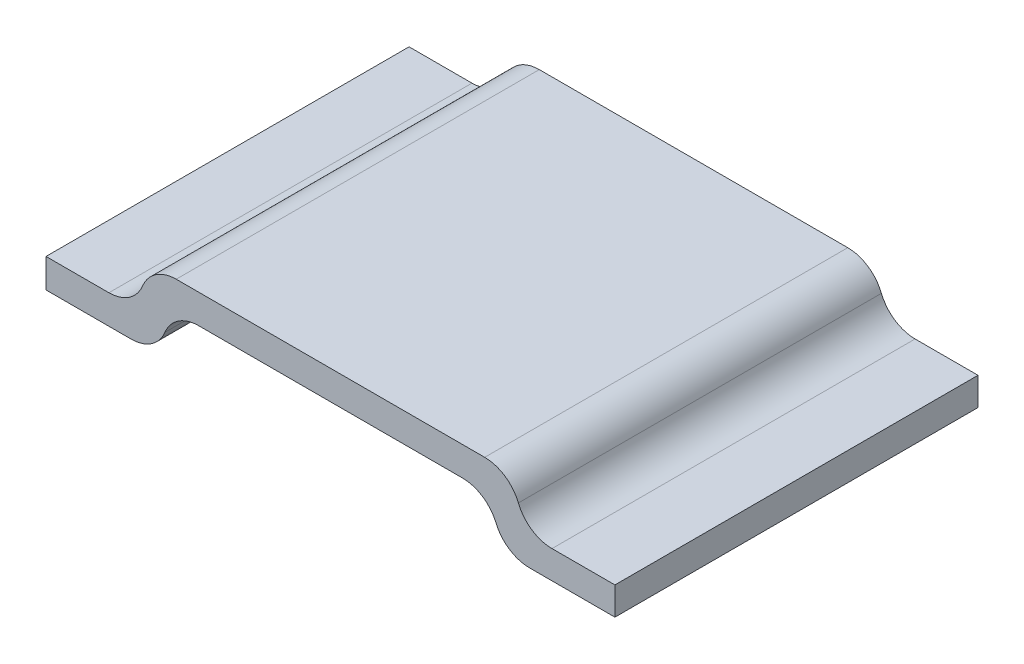
ISO-10303-21;
HEADER;
FILE_DESCRIPTION(('STEP AP214'),'2;1');
FILE_NAME('part.step','',(''),(''),'','','');
FILE_SCHEMA(('AUTOMOTIVE_DESIGN { 1 0 10303 214 1 1 1 1 }'));
ENDSEC;
DATA;
#1=APPLICATION_CONTEXT('core data for automotive mechanical design processes');
#2=APPLICATION_PROTOCOL_DEFINITION('international standard','automotive_design',2000,#1);
#3=PRODUCT_CONTEXT('',#1,'mechanical');
#4=PRODUCT('Part','Part','',(#3));
#5=PRODUCT_RELATED_PRODUCT_CATEGORY('part','',(#4));
#6=PRODUCT_DEFINITION_FORMATION('','',#4);
#7=PRODUCT_DEFINITION_CONTEXT('part definition',#1,'design');
#8=PRODUCT_DEFINITION('design','',#6,#7);
#9=PRODUCT_DEFINITION_SHAPE('','',#8);
#10=(LENGTH_UNIT() NAMED_UNIT(*) SI_UNIT(.MILLI.,.METRE.));
#11=(NAMED_UNIT(*) PLANE_ANGLE_UNIT() SI_UNIT($,.RADIAN.));
#12=(NAMED_UNIT(*) SI_UNIT($,.STERADIAN.) SOLID_ANGLE_UNIT());
#13=UNCERTAINTY_MEASURE_WITH_UNIT(LENGTH_MEASURE(1.E-05),#10,'distance_accuracy_value','');
#14=(GEOMETRIC_REPRESENTATION_CONTEXT(3) GLOBAL_UNCERTAINTY_ASSIGNED_CONTEXT((#13)) GLOBAL_UNIT_ASSIGNED_CONTEXT((#10,
#11,#12)) REPRESENTATION_CONTEXT('',''));
#15=CARTESIAN_POINT('',(0.,0.,0.));
#16=DIRECTION('',(0.,0.,1.));
#17=DIRECTION('',(1.,0.,0.));
#18=AXIS2_PLACEMENT_3D('',#15,#16,#17);
#19=CARTESIAN_POINT('',(-11.1407915604267,-2.032,25.4));
#20=DIRECTION('',(0.,1.,0.));
#21=DIRECTION('',(0.,0.,1.));
#22=AXIS2_PLACEMENT_3D('',#19,#20,#21);
#23=PLANE('',#22);
#24=DIRECTION('',(1.,0.,0.));
#25=VECTOR('',#24,1.);
#26=CARTESIAN_POINT('',(-11.1407915604267,-2.032,0.));
#27=LINE('',#26,#25);
#28=CARTESIAN_POINT('',(-9.23125475655637,-2.032,0.));
#29=VERTEX_POINT('',#28);
#30=CARTESIAN_POINT('',(9.24226086338546,-2.032,0.));
#31=VERTEX_POINT('',#30);
#32=EDGE_CURVE('E188',#29,#31,#27,.T.);
#33=ORIENTED_EDGE('',*,*,#32,.T.);
#34=DIRECTION('',(0.,0.,-1.));
#35=VECTOR('',#34,1.);
#36=CARTESIAN_POINT('',(9.24226086338547,-2.032,25.4));
#37=LINE('',#36,#35);
#38=CARTESIAN_POINT('',(9.24226086338546,-2.032,25.4));
#39=VERTEX_POINT('',#38);
#40=EDGE_CURVE('E249',#31,#39,#37,.F.);
#41=ORIENTED_EDGE('',*,*,#40,.T.);
#42=DIRECTION('',(1.,0.,0.));
#43=VECTOR('',#42,1.);
#44=CARTESIAN_POINT('',(-11.1407915604267,-2.032,25.4));
#45=LINE('',#44,#43);
#46=CARTESIAN_POINT('',(-9.23125475655637,-2.032,25.4));
#47=VERTEX_POINT('',#46);
#48=EDGE_CURVE('E158',#47,#39,#45,.T.);
#49=ORIENTED_EDGE('',*,*,#48,.F.);
#50=DIRECTION('',(0.,0.,-1.));
#51=VECTOR('',#50,1.);
#52=CARTESIAN_POINT('',(-9.23125475655637,-2.032,25.4));
#53=LINE('',#52,#51);
#54=EDGE_CURVE('E246',#47,#29,#53,.T.);
#55=ORIENTED_EDGE('',*,*,#54,.T.);
#56=EDGE_LOOP('',(#33,#41,#49,#55));
#57=FACE_BOUND('',#56,.T.);
#58=ADVANCED_FACE('F34',(#57),#23,.F.);
#59=CARTESIAN_POINT('',(11.9713240192223,-5.13158933356001,25.4));
#60=DIRECTION('',(0.,1.,0.));
#61=DIRECTION('',(0.,0.,1.));
#62=AXIS2_PLACEMENT_3D('',#59,#60,#61);
#63=PLANE('',#62);
#64=DIRECTION('',(1.,0.,0.));
#65=VECTOR('',#64,1.);
#66=CARTESIAN_POINT('',(11.9713240192223,-5.13158933356001,25.4));
#67=LINE('',#66,#65);
#68=CARTESIAN_POINT('',(13.9203345686888,-5.13158933356001,25.4));
#69=VERTEX_POINT('',#68);
#70=CARTESIAN_POINT('',(19.9007386859688,-5.13158933356001,25.4));
#71=VERTEX_POINT('',#70);
#72=EDGE_CURVE('E146',#69,#71,#67,.T.);
#73=ORIENTED_EDGE('',*,*,#72,.F.);
#74=DIRECTION('',(0.,0.,-1.));
#75=VECTOR('',#74,1.);
#76=CARTESIAN_POINT('',(13.9203345686888,-5.13158933356001,25.4));
#77=LINE('',#76,#75);
#78=CARTESIAN_POINT('',(13.9203345686888,-5.13158933356001,0.));
#79=VERTEX_POINT('',#78);
#80=EDGE_CURVE('E238',#69,#79,#77,.T.);
#81=ORIENTED_EDGE('',*,*,#80,.T.);
#82=DIRECTION('',(1.,0.,0.));
#83=VECTOR('',#82,1.);
#84=CARTESIAN_POINT('',(11.9713240192223,-5.13158933356001,0.));
#85=LINE('',#84,#83);
#86=CARTESIAN_POINT('',(19.9007386859688,-5.13158933356001,0.));
#87=VERTEX_POINT('',#86);
#88=EDGE_CURVE('E164',#79,#87,#85,.T.);
#89=ORIENTED_EDGE('',*,*,#88,.T.);
#90=DIRECTION('',(0.,0.,-1.));
#91=VECTOR('',#90,1.);
#92=CARTESIAN_POINT('',(19.9007386859688,-5.13158933356001,25.4));
#93=LINE('',#92,#91);
#94=EDGE_CURVE('E161',#71,#87,#93,.T.);
#95=ORIENTED_EDGE('',*,*,#94,.F.);
#96=EDGE_LOOP('',(#73,#81,#89,#95));
#97=FACE_BOUND('',#96,.T.);
#98=ADVANCED_FACE('F162',(#97),#63,.F.);
#99=CARTESIAN_POINT('',(19.9007386859688,-5.13158933356001,25.4));
#100=DIRECTION('',(-1.,0.,0.));
#101=DIRECTION('',(0.,0.,1.));
#102=AXIS2_PLACEMENT_3D('',#99,#100,#101);
#103=PLANE('',#102);
#104=DIRECTION('',(0.,1.,0.));
#105=VECTOR('',#104,1.);
#106=CARTESIAN_POINT('',(19.9007386859688,-5.13158933356001,0.));
#107=LINE('',#106,#105);
#108=CARTESIAN_POINT('',(19.9007386859688,-3.175,0.));
#109=VERTEX_POINT('',#108);
#110=EDGE_CURVE('E192',#87,#109,#107,.T.);
#111=ORIENTED_EDGE('',*,*,#110,.T.);
#112=DIRECTION('',(0.,0.,-1.));
#113=VECTOR('',#112,1.);
#114=CARTESIAN_POINT('',(19.9007386859688,-3.175,25.4));
#115=LINE('',#114,#113);
#116=CARTESIAN_POINT('',(19.9007386859688,-3.175,25.4));
#117=VERTEX_POINT('',#116);
#118=EDGE_CURVE('E168',#117,#109,#115,.T.);
#119=ORIENTED_EDGE('',*,*,#118,.F.);
#120=DIRECTION('',(0.,1.,0.));
#121=VECTOR('',#120,1.);
#122=CARTESIAN_POINT('',(19.9007386859688,-5.13158933356001,25.4));
#123=LINE('',#122,#121);
#124=EDGE_CURVE('E151',#71,#117,#123,.T.);
#125=ORIENTED_EDGE('',*,*,#124,.F.);
#126=ORIENTED_EDGE('',*,*,#94,.T.);
#127=EDGE_LOOP('',(#111,#119,#125,#126));
#128=FACE_BOUND('',#127,.T.);
#129=ADVANCED_FACE('F170',(#128),#103,.F.);
#130=CARTESIAN_POINT('',(13.5507386859688,-3.175,25.4));
#131=DIRECTION('',(0.,-1.,0.));
#132=DIRECTION('',(1.,0.,0.));
#133=AXIS2_PLACEMENT_3D('',#130,#131,#132);
#134=PLANE('',#133);
#135=DIRECTION('',(-1.,0.,0.));
#136=VECTOR('',#135,1.);
#137=CARTESIAN_POINT('',(13.5507386859688,-3.175,0.));
#138=LINE('',#137,#136);
#139=CARTESIAN_POINT('',(15.4997492354354,-3.175,0.));
#140=VERTEX_POINT('',#139);
#141=EDGE_CURVE('E194',#109,#140,#138,.T.);
#142=ORIENTED_EDGE('',*,*,#141,.T.);
#143=DIRECTION('',(0.,0.,-1.));
#144=VECTOR('',#143,1.);
#145=CARTESIAN_POINT('',(15.4997492354354,-3.175,25.4));
#146=LINE('',#145,#144);
#147=CARTESIAN_POINT('',(15.4997492354354,-3.175,25.4));
#148=VERTEX_POINT('',#147);
#149=EDGE_CURVE('E167',#140,#148,#146,.F.);
#150=ORIENTED_EDGE('',*,*,#149,.T.);
#151=DIRECTION('',(-1.,0.,0.));
#152=VECTOR('',#151,1.);
#153=CARTESIAN_POINT('',(13.5507386859688,-3.175,25.4));
#154=LINE('',#153,#152);
#155=EDGE_CURVE('E173',#117,#148,#154,.T.);
#156=ORIENTED_EDGE('',*,*,#155,.F.);
#157=ORIENTED_EDGE('',*,*,#118,.T.);
#158=EDGE_LOOP('',(#142,#150,#156,#157));
#159=FACE_BOUND('',#158,.T.);
#160=ADVANCED_FACE('F334',(#159),#134,.F.);
#161=CARTESIAN_POINT('',(-12.7,0.,25.4));
#162=DIRECTION('',(0.,-1.,0.));
#163=DIRECTION('',(0.,0.,-1.));
#164=AXIS2_PLACEMENT_3D('',#161,#162,#163);
#165=PLANE('',#164);
#166=DIRECTION('',(-1.,0.,0.));
#167=VECTOR('',#166,1.);
#168=CARTESIAN_POINT('',(-12.7,0.,0.));
#169=LINE('',#168,#167);
#170=CARTESIAN_POINT('',(10.7904631961296,0.,0.));
#171=VERTEX_POINT('',#170);
#172=CARTESIAN_POINT('',(-10.7904631961296,0.,0.));
#173=VERTEX_POINT('',#172);
#174=EDGE_CURVE('E197',#171,#173,#169,.T.);
#175=ORIENTED_EDGE('',*,*,#174,.T.);
#176=DIRECTION('',(0.,0.,1.));
#177=VECTOR('',#176,1.);
#178=CARTESIAN_POINT('',(-10.7904631961296,0.,25.4));
#179=LINE('',#178,#177);
#180=CARTESIAN_POINT('',(-10.7904631961296,0.,25.4));
#181=VERTEX_POINT('',#180);
#182=EDGE_CURVE('E42',#173,#181,#179,.T.);
#183=ORIENTED_EDGE('',*,*,#182,.T.);
#184=DIRECTION('',(-1.,0.,0.));
#185=VECTOR('',#184,1.);
#186=CARTESIAN_POINT('',(-12.7,0.,25.4));
#187=LINE('',#186,#185);
#188=CARTESIAN_POINT('',(10.7904631961296,0.,25.4));
#189=VERTEX_POINT('',#188);
#190=EDGE_CURVE('E175',#189,#181,#187,.T.);
#191=ORIENTED_EDGE('',*,*,#190,.F.);
#192=DIRECTION('',(0.,0.,1.));
#193=VECTOR('',#192,1.);
#194=CARTESIAN_POINT('',(10.7904631961296,0.,25.4));
#195=LINE('',#194,#193);
#196=EDGE_CURVE('E218',#189,#171,#195,.F.);
#197=ORIENTED_EDGE('',*,*,#196,.T.);
#198=EDGE_LOOP('',(#175,#183,#191,#197));
#199=FACE_BOUND('',#198,.T.);
#200=ADVANCED_FACE('F341',(#199),#165,.F.);
#201=CARTESIAN_POINT('',(-13.5507386859688,-3.175,25.4));
#202=DIRECTION('',(0.,-1.,0.));
#203=DIRECTION('',(1.,0.,0.));
#204=AXIS2_PLACEMENT_3D('',#201,#202,#203);
#205=PLANE('',#204);
#206=DIRECTION('',(-1.,0.,0.));
#207=VECTOR('',#206,1.);
#208=CARTESIAN_POINT('',(-13.5507386859688,-3.175,25.4));
#209=LINE('',#208,#207);
#210=CARTESIAN_POINT('',(-15.4997492354354,-3.175,25.4));
#211=VERTEX_POINT('',#210);
#212=CARTESIAN_POINT('',(-19.9007386859688,-3.175,25.4));
#213=VERTEX_POINT('',#212);
#214=EDGE_CURVE('E180',#211,#213,#209,.T.);
#215=ORIENTED_EDGE('',*,*,#214,.F.);
#216=DIRECTION('',(0.,0.,-1.));
#217=VECTOR('',#216,1.);
#218=CARTESIAN_POINT('',(-15.4997492354354,-3.175,0.));
#219=LINE('',#218,#217);
#220=CARTESIAN_POINT('',(-15.4997492354354,-3.175,0.));
#221=VERTEX_POINT('',#220);
#222=EDGE_CURVE('E240',#211,#221,#219,.T.);
#223=ORIENTED_EDGE('',*,*,#222,.T.);
#224=DIRECTION('',(-1.,0.,0.));
#225=VECTOR('',#224,1.);
#226=CARTESIAN_POINT('',(-13.5507386859688,-3.175,0.));
#227=LINE('',#226,#225);
#228=CARTESIAN_POINT('',(-19.9007386859688,-3.175,0.));
#229=VERTEX_POINT('',#228);
#230=EDGE_CURVE('E199',#221,#229,#227,.T.);
#231=ORIENTED_EDGE('',*,*,#230,.T.);
#232=DIRECTION('',(0.,0.,-1.));
#233=VECTOR('',#232,1.);
#234=CARTESIAN_POINT('',(-19.9007386859688,-3.175,25.4));
#235=LINE('',#234,#233);
#236=EDGE_CURVE('E208',#213,#229,#235,.T.);
#237=ORIENTED_EDGE('',*,*,#236,.F.);
#238=EDGE_LOOP('',(#215,#223,#231,#237));
#239=FACE_BOUND('',#238,.T.);
#240=ADVANCED_FACE('F282',(#239),#205,.F.);
#241=CARTESIAN_POINT('',(-19.9007386859688,-5.207,25.4));
#242=DIRECTION('',(1.,0.,0.));
#243=DIRECTION('',(0.,0.,-1.));
#244=AXIS2_PLACEMENT_3D('',#241,#242,#243);
#245=PLANE('',#244);
#246=DIRECTION('',(0.,-1.,0.));
#247=VECTOR('',#246,1.);
#248=CARTESIAN_POINT('',(-19.9007386859688,-5.207,0.));
#249=LINE('',#248,#247);
#250=CARTESIAN_POINT('',(-19.9007386859688,-5.207,0.));
#251=VERTEX_POINT('',#250);
#252=EDGE_CURVE('E201',#229,#251,#249,.T.);
#253=ORIENTED_EDGE('',*,*,#252,.T.);
#254=DIRECTION('',(0.,0.,-1.));
#255=VECTOR('',#254,1.);
#256=CARTESIAN_POINT('',(-19.9007386859688,-5.207,25.4));
#257=LINE('',#256,#255);
#258=CARTESIAN_POINT('',(-19.9007386859688,-5.207,25.4));
#259=VERTEX_POINT('',#258);
#260=EDGE_CURVE('E187',#259,#251,#257,.T.);
#261=ORIENTED_EDGE('',*,*,#260,.F.);
#262=DIRECTION('',(0.,-1.,0.));
#263=VECTOR('',#262,1.);
#264=CARTESIAN_POINT('',(-19.9007386859688,-5.207,25.4));
#265=LINE('',#264,#263);
#266=EDGE_CURVE('E182',#213,#259,#265,.T.);
#267=ORIENTED_EDGE('',*,*,#266,.F.);
#268=ORIENTED_EDGE('',*,*,#236,.T.);
#269=EDGE_LOOP('',(#253,#261,#267,#268));
#270=FACE_BOUND('',#269,.T.);
#271=ADVANCED_FACE('F285',(#270),#245,.F.);
#272=CARTESIAN_POINT('',(-11.9915302463956,-5.207,25.4));
#273=DIRECTION('',(0.,1.,0.));
#274=DIRECTION('',(-1.,0.,0.));
#275=AXIS2_PLACEMENT_3D('',#272,#273,#274);
#276=PLANE('',#275);
#277=DIRECTION('',(1.,0.,0.));
#278=VECTOR('',#277,1.);
#279=CARTESIAN_POINT('',(-11.9915302463956,-5.207,0.));
#280=LINE('',#279,#278);
#281=CARTESIAN_POINT('',(-13.9405407958621,-5.207,0.));
#282=VERTEX_POINT('',#281);
#283=EDGE_CURVE('E203',#251,#282,#280,.T.);
#284=ORIENTED_EDGE('',*,*,#283,.T.);
#285=DIRECTION('',(0.,0.,-1.));
#286=VECTOR('',#285,1.);
#287=CARTESIAN_POINT('',(-13.9405407958621,-5.207,25.4));
#288=LINE('',#287,#286);
#289=CARTESIAN_POINT('',(-13.9405407958621,-5.207,25.4));
#290=VERTEX_POINT('',#289);
#291=EDGE_CURVE('E232',#282,#290,#288,.F.);
#292=ORIENTED_EDGE('',*,*,#291,.T.);
#293=DIRECTION('',(1.,0.,0.));
#294=VECTOR('',#293,1.);
#295=CARTESIAN_POINT('',(-11.9915302463956,-5.207,25.4));
#296=LINE('',#295,#294);
#297=EDGE_CURVE('E184',#259,#290,#296,.T.);
#298=ORIENTED_EDGE('',*,*,#297,.F.);
#299=ORIENTED_EDGE('',*,*,#260,.T.);
#300=EDGE_LOOP('',(#284,#292,#298,#299));
#301=FACE_BOUND('',#300,.T.);
#302=ADVANCED_FACE('F390',(#301),#276,.F.);
#303=CARTESIAN_POINT('',(0.,0.,25.4));
#304=DIRECTION('',(0.,0.,-1.));
#305=DIRECTION('',(-1.,0.,0.));
#306=AXIS2_PLACEMENT_3D('',#303,#304,#305);
#307=PLANE('',#306);
#308=ORIENTED_EDGE('',*,*,#190,.T.);
#309=CARTESIAN_POINT('',(-10.7904631961296,-2.54,25.4));
#310=DIRECTION('',(0.,0.,-1.));
#311=DIRECTION('',(-1.,0.,0.));
#312=AXIS2_PLACEMENT_3D('',#309,#310,#311);
#313=CIRCLE('',#312,2.54);
#314=CARTESIAN_POINT('',(-13.1451062157825,-1.5875,25.4));
#315=VERTEX_POINT('',#314);
#316=EDGE_CURVE('E11',#181,#315,#313,.F.);
#317=ORIENTED_EDGE('',*,*,#316,.T.);
#318=CARTESIAN_POINT('',(-15.4997492354354,-0.635,25.4));
#319=DIRECTION('',(0.,0.,-1.));
#320=DIRECTION('',(-1.,0.,0.));
#321=AXIS2_PLACEMENT_3D('',#318,#319,#320);
#322=CIRCLE('',#321,2.54);
#323=EDGE_CURVE('E255',#315,#211,#322,.T.);
#324=ORIENTED_EDGE('',*,*,#323,.T.);
#325=ORIENTED_EDGE('',*,*,#214,.T.);
#326=ORIENTED_EDGE('',*,*,#266,.T.);
#327=ORIENTED_EDGE('',*,*,#297,.T.);
#328=CARTESIAN_POINT('',(-13.9405407958621,-2.667,25.4));
#329=DIRECTION('',(0.,0.,-1.));
#330=DIRECTION('',(-1.,0.,0.));
#331=AXIS2_PLACEMENT_3D('',#328,#329,#330);
#332=CIRCLE('',#331,2.54);
#333=CARTESIAN_POINT('',(-11.5858977762092,-3.6195,25.4));
#334=VERTEX_POINT('',#333);
#335=EDGE_CURVE('E235',#290,#334,#332,.F.);
#336=ORIENTED_EDGE('',*,*,#335,.T.);
#337=CARTESIAN_POINT('',(-9.23125475655637,-4.572,25.4));
#338=DIRECTION('',(0.,0.,-1.));
#339=DIRECTION('',(-1.,0.,0.));
#340=AXIS2_PLACEMENT_3D('',#337,#338,#339);
#341=CIRCLE('',#340,2.54);
#342=EDGE_CURVE('E263',#334,#47,#341,.T.);
#343=ORIENTED_EDGE('',*,*,#342,.T.);
#344=ORIENTED_EDGE('',*,*,#48,.T.);
#345=CARTESIAN_POINT('',(9.24226086338547,-4.572,25.4));
#346=DIRECTION('',(0.,0.,-1.));
#347=DIRECTION('',(-1.,0.,0.));
#348=AXIS2_PLACEMENT_3D('',#345,#346,#347);
#349=CIRCLE('',#348,2.54);
#350=CARTESIAN_POINT('',(11.5812977160372,-3.58179466678001,25.4));
#351=VERTEX_POINT('',#350);
#352=EDGE_CURVE('E259',#39,#351,#349,.T.);
#353=ORIENTED_EDGE('',*,*,#352,.T.);
#354=CARTESIAN_POINT('',(13.9203345686888,-2.59158933356001,25.4));
#355=DIRECTION('',(0.,0.,-1.));
#356=DIRECTION('',(-1.,0.,0.));
#357=AXIS2_PLACEMENT_3D('',#354,#355,#356);
#358=CIRCLE('',#357,2.54);
#359=EDGE_CURVE('E154',#351,#69,#358,.F.);
#360=ORIENTED_EDGE('',*,*,#359,.T.);
#361=ORIENTED_EDGE('',*,*,#72,.T.);
#362=ORIENTED_EDGE('',*,*,#124,.T.);
#363=ORIENTED_EDGE('',*,*,#155,.T.);
#364=CARTESIAN_POINT('',(15.4997492354354,-0.635,25.4));
#365=DIRECTION('',(0.,0.,-1.));
#366=DIRECTION('',(-1.,0.,0.));
#367=AXIS2_PLACEMENT_3D('',#364,#365,#366);
#368=CIRCLE('',#367,2.54);
#369=CARTESIAN_POINT('',(13.1451062157825,-1.5875,25.4));
#370=VERTEX_POINT('',#369);
#371=EDGE_CURVE('E215',#148,#370,#368,.T.);
#372=ORIENTED_EDGE('',*,*,#371,.T.);
#373=CARTESIAN_POINT('',(10.7904631961296,-2.54,25.4));
#374=DIRECTION('',(0.,0.,-1.));
#375=DIRECTION('',(-1.,0.,0.));
#376=AXIS2_PLACEMENT_3D('',#373,#374,#375);
#377=CIRCLE('',#376,2.54);
#378=EDGE_CURVE('E225',#370,#189,#377,.F.);
#379=ORIENTED_EDGE('',*,*,#378,.T.);
#380=EDGE_LOOP('',(#308,#317,#324,#325,#326,#327,#336,#343,#344,#353,#360,#361,#362,#363,#372,#379));
#381=FACE_BOUND('',#380,.T.);
#382=ADVANCED_FACE('F148',(#381),#307,.F.);
#383=CARTESIAN_POINT('',(0.,0.,0.));
#384=DIRECTION('',(0.,0.,-1.));
#385=DIRECTION('',(-1.,0.,0.));
#386=AXIS2_PLACEMENT_3D('',#383,#384,#385);
#387=PLANE('',#386);
#388=CARTESIAN_POINT('',(-15.4997492354354,-0.635,0.));
#389=DIRECTION('',(0.,0.,-1.));
#390=DIRECTION('',(-1.,0.,0.));
#391=AXIS2_PLACEMENT_3D('',#388,#389,#390);
#392=CIRCLE('',#391,2.54);
#393=CARTESIAN_POINT('',(-13.1451062157825,-1.5875,0.));
#394=VERTEX_POINT('',#393);
#395=EDGE_CURVE('E253',#221,#394,#392,.F.);
#396=ORIENTED_EDGE('',*,*,#395,.T.);
#397=CARTESIAN_POINT('',(-10.7904631961296,-2.54,0.));
#398=DIRECTION('',(0.,0.,-1.));
#399=DIRECTION('',(-1.,0.,0.));
#400=AXIS2_PLACEMENT_3D('',#397,#398,#399);
#401=CIRCLE('',#400,2.54);
#402=EDGE_CURVE('E56',#394,#173,#401,.T.);
#403=ORIENTED_EDGE('',*,*,#402,.T.);
#404=ORIENTED_EDGE('',*,*,#174,.F.);
#405=CARTESIAN_POINT('',(10.7904631961296,-2.54,0.));
#406=DIRECTION('',(0.,0.,-1.));
#407=DIRECTION('',(-1.,0.,0.));
#408=AXIS2_PLACEMENT_3D('',#405,#406,#407);
#409=CIRCLE('',#408,2.54);
#410=CARTESIAN_POINT('',(13.1451062157825,-1.5875,0.));
#411=VERTEX_POINT('',#410);
#412=EDGE_CURVE('E221',#171,#411,#409,.T.);
#413=ORIENTED_EDGE('',*,*,#412,.T.);
#414=CARTESIAN_POINT('',(15.4997492354354,-0.635,0.));
#415=DIRECTION('',(0.,0.,-1.));
#416=DIRECTION('',(-1.,0.,0.));
#417=AXIS2_PLACEMENT_3D('',#414,#415,#416);
#418=CIRCLE('',#417,2.54);
#419=EDGE_CURVE('E213',#411,#140,#418,.F.);
#420=ORIENTED_EDGE('',*,*,#419,.T.);
#421=ORIENTED_EDGE('',*,*,#141,.F.);
#422=ORIENTED_EDGE('',*,*,#110,.F.);
#423=ORIENTED_EDGE('',*,*,#88,.F.);
#424=CARTESIAN_POINT('',(13.9203345686888,-2.59158933356001,0.));
#425=DIRECTION('',(0.,0.,-1.));
#426=DIRECTION('',(-1.,0.,0.));
#427=AXIS2_PLACEMENT_3D('',#424,#425,#426);
#428=CIRCLE('',#427,2.54);
#429=CARTESIAN_POINT('',(11.5812977160372,-3.58179466678001,0.));
#430=VERTEX_POINT('',#429);
#431=EDGE_CURVE('E227',#79,#430,#428,.T.);
#432=ORIENTED_EDGE('',*,*,#431,.T.);
#433=CARTESIAN_POINT('',(9.24226086338547,-4.572,0.));
#434=DIRECTION('',(0.,0.,-1.));
#435=DIRECTION('',(-1.,0.,0.));
#436=AXIS2_PLACEMENT_3D('',#433,#434,#435);
#437=CIRCLE('',#436,2.54);
#438=EDGE_CURVE('E257',#430,#31,#437,.F.);
#439=ORIENTED_EDGE('',*,*,#438,.T.);
#440=ORIENTED_EDGE('',*,*,#32,.F.);
#441=CARTESIAN_POINT('',(-9.23125475655637,-4.572,0.));
#442=DIRECTION('',(0.,0.,-1.));
#443=DIRECTION('',(-1.,0.,0.));
#444=AXIS2_PLACEMENT_3D('',#441,#442,#443);
#445=CIRCLE('',#444,2.54);
#446=CARTESIAN_POINT('',(-11.5858977762092,-3.6195,0.));
#447=VERTEX_POINT('',#446);
#448=EDGE_CURVE('E261',#29,#447,#445,.F.);
#449=ORIENTED_EDGE('',*,*,#448,.T.);
#450=CARTESIAN_POINT('',(-13.9405407958621,-2.667,0.));
#451=DIRECTION('',(0.,0.,-1.));
#452=DIRECTION('',(-1.,0.,0.));
#453=AXIS2_PLACEMENT_3D('',#450,#451,#452);
#454=CIRCLE('',#453,2.54);
#455=EDGE_CURVE('E230',#447,#282,#454,.T.);
#456=ORIENTED_EDGE('',*,*,#455,.T.);
#457=ORIENTED_EDGE('',*,*,#283,.F.);
#458=ORIENTED_EDGE('',*,*,#252,.F.);
#459=ORIENTED_EDGE('',*,*,#230,.F.);
#460=EDGE_LOOP('',(#396,#403,#404,#413,#420,#421,#422,#423,#432,#439,#440,#449,#456,#457,#458,#459));
#461=FACE_BOUND('',#460,.T.);
#462=ADVANCED_FACE('F276',(#461),#387,.T.);
#463=CARTESIAN_POINT('',(15.4997492354354,-0.635,25.4));
#464=DIRECTION('',(0.,0.,1.));
#465=DIRECTION('',(1.,0.,0.));
#466=AXIS2_PLACEMENT_3D('',#463,#464,#465);
#467=CYLINDRICAL_SURFACE('',#466,2.54);
#468=ORIENTED_EDGE('',*,*,#419,.F.);
#469=DIRECTION('',(0.,0.,1.));
#470=VECTOR('',#469,1.);
#471=CARTESIAN_POINT('',(13.1451062157825,-1.5875,25.4));
#472=LINE('',#471,#470);
#473=EDGE_CURVE('E223',#411,#370,#472,.T.);
#474=ORIENTED_EDGE('',*,*,#473,.T.);
#475=ORIENTED_EDGE('',*,*,#371,.F.);
#476=ORIENTED_EDGE('',*,*,#149,.F.);
#477=EDGE_LOOP('',(#468,#474,#475,#476));
#478=FACE_BOUND('',#477,.T.);
#479=ADVANCED_FACE('F305',(#478),#467,.F.);
#480=CARTESIAN_POINT('',(10.7904631961296,-2.54,25.4));
#481=DIRECTION('',(0.,0.,1.));
#482=DIRECTION('',(1.,0.,0.));
#483=AXIS2_PLACEMENT_3D('',#480,#481,#482);
#484=CYLINDRICAL_SURFACE('',#483,2.54);
#485=ORIENTED_EDGE('',*,*,#378,.F.);
#486=ORIENTED_EDGE('',*,*,#473,.F.);
#487=ORIENTED_EDGE('',*,*,#412,.F.);
#488=ORIENTED_EDGE('',*,*,#196,.F.);
#489=EDGE_LOOP('',(#485,#486,#487,#488));
#490=FACE_BOUND('',#489,.T.);
#491=ADVANCED_FACE('F308',(#490),#484,.T.);
#492=CARTESIAN_POINT('',(-13.9405407958621,-2.667,25.4));
#493=DIRECTION('',(0.,0.,-1.));
#494=DIRECTION('',(-1.,0.,0.));
#495=AXIS2_PLACEMENT_3D('',#492,#493,#494);
#496=CYLINDRICAL_SURFACE('',#495,2.54);
#497=ORIENTED_EDGE('',*,*,#455,.F.);
#498=DIRECTION('',(0.,0.,-1.));
#499=VECTOR('',#498,1.);
#500=CARTESIAN_POINT('',(-11.5858977762092,-3.6195,25.4));
#501=LINE('',#500,#499);
#502=EDGE_CURVE('E251',#447,#334,#501,.F.);
#503=ORIENTED_EDGE('',*,*,#502,.T.);
#504=ORIENTED_EDGE('',*,*,#335,.F.);
#505=ORIENTED_EDGE('',*,*,#291,.F.);
#506=EDGE_LOOP('',(#497,#503,#504,#505));
#507=FACE_BOUND('',#506,.T.);
#508=ADVANCED_FACE('F312',(#507),#496,.T.);
#509=CARTESIAN_POINT('',(13.9203345686888,-2.59158933356001,25.4));
#510=DIRECTION('',(0.,0.,-1.));
#511=DIRECTION('',(-1.,0.,0.));
#512=AXIS2_PLACEMENT_3D('',#509,#510,#511);
#513=CYLINDRICAL_SURFACE('',#512,2.54);
#514=ORIENTED_EDGE('',*,*,#359,.F.);
#515=DIRECTION('',(0.,0.,-1.));
#516=VECTOR('',#515,1.);
#517=CARTESIAN_POINT('',(11.5812977160372,-3.58179466678001,25.4));
#518=LINE('',#517,#516);
#519=EDGE_CURVE('E243',#351,#430,#518,.T.);
#520=ORIENTED_EDGE('',*,*,#519,.T.);
#521=ORIENTED_EDGE('',*,*,#431,.F.);
#522=ORIENTED_EDGE('',*,*,#80,.F.);
#523=EDGE_LOOP('',(#514,#520,#521,#522));
#524=FACE_BOUND('',#523,.T.);
#525=ADVANCED_FACE('F316',(#524),#513,.T.);
#526=CARTESIAN_POINT('',(-15.4997492354354,-0.635,25.4));
#527=DIRECTION('',(0.,0.,1.));
#528=DIRECTION('',(1.,0.,0.));
#529=AXIS2_PLACEMENT_3D('',#526,#527,#528);
#530=CYLINDRICAL_SURFACE('',#529,2.54);
#531=ORIENTED_EDGE('',*,*,#323,.F.);
#532=DIRECTION('',(0.,0.,1.));
#533=VECTOR('',#532,1.);
#534=CARTESIAN_POINT('',(-13.1451062157825,-1.5875,25.4));
#535=LINE('',#534,#533);
#536=EDGE_CURVE('E265',#315,#394,#535,.F.);
#537=ORIENTED_EDGE('',*,*,#536,.T.);
#538=ORIENTED_EDGE('',*,*,#395,.F.);
#539=ORIENTED_EDGE('',*,*,#222,.F.);
#540=EDGE_LOOP('',(#531,#537,#538,#539));
#541=FACE_BOUND('',#540,.T.);
#542=ADVANCED_FACE('F271',(#541),#530,.F.);
#543=CARTESIAN_POINT('',(9.24226086338547,-4.572,25.4));
#544=DIRECTION('',(0.,0.,-1.));
#545=DIRECTION('',(-1.,0.,0.));
#546=AXIS2_PLACEMENT_3D('',#543,#544,#545);
#547=CYLINDRICAL_SURFACE('',#546,2.54);
#548=ORIENTED_EDGE('',*,*,#352,.F.);
#549=ORIENTED_EDGE('',*,*,#40,.F.);
#550=ORIENTED_EDGE('',*,*,#438,.F.);
#551=ORIENTED_EDGE('',*,*,#519,.F.);
#552=EDGE_LOOP('',(#548,#549,#550,#551));
#553=FACE_BOUND('',#552,.T.);
#554=ADVANCED_FACE('F294',(#553),#547,.F.);
#555=CARTESIAN_POINT('',(-9.23125475655637,-4.572,25.4));
#556=DIRECTION('',(0.,0.,-1.));
#557=DIRECTION('',(-1.,0.,0.));
#558=AXIS2_PLACEMENT_3D('',#555,#556,#557);
#559=CYLINDRICAL_SURFACE('',#558,2.54);
#560=ORIENTED_EDGE('',*,*,#342,.F.);
#561=ORIENTED_EDGE('',*,*,#502,.F.);
#562=ORIENTED_EDGE('',*,*,#448,.F.);
#563=ORIENTED_EDGE('',*,*,#54,.F.);
#564=EDGE_LOOP('',(#560,#561,#562,#563));
#565=FACE_BOUND('',#564,.T.);
#566=ADVANCED_FACE('F290',(#565),#559,.F.);
#567=CARTESIAN_POINT('',(-10.7904631961296,-2.54,25.4));
#568=DIRECTION('',(0.,0.,1.));
#569=DIRECTION('',(1.,0.,0.));
#570=AXIS2_PLACEMENT_3D('',#567,#568,#569);
#571=CYLINDRICAL_SURFACE('',#570,2.54);
#572=ORIENTED_EDGE('',*,*,#316,.F.);
#573=ORIENTED_EDGE('',*,*,#182,.F.);
#574=ORIENTED_EDGE('',*,*,#402,.F.);
#575=ORIENTED_EDGE('',*,*,#536,.F.);
#576=EDGE_LOOP('',(#572,#573,#574,#575));
#577=FACE_BOUND('',#576,.T.);
#578=ADVANCED_FACE('F36',(#577),#571,.T.);
#579=CLOSED_SHELL('',(#58,#98,#129,#160,#200,#240,#271,#302,#382,#462,#479,#491,#508,#525,#542,
#554,#566,#578));
#580=MANIFOLD_SOLID_BREP('B2',#579);
#581=ADVANCED_BREP_SHAPE_REPRESENTATION('',(#18,#580),#14);
#582=SHAPE_DEFINITION_REPRESENTATION(#9,#581);
ENDSEC;
END-ISO-10303-21;
